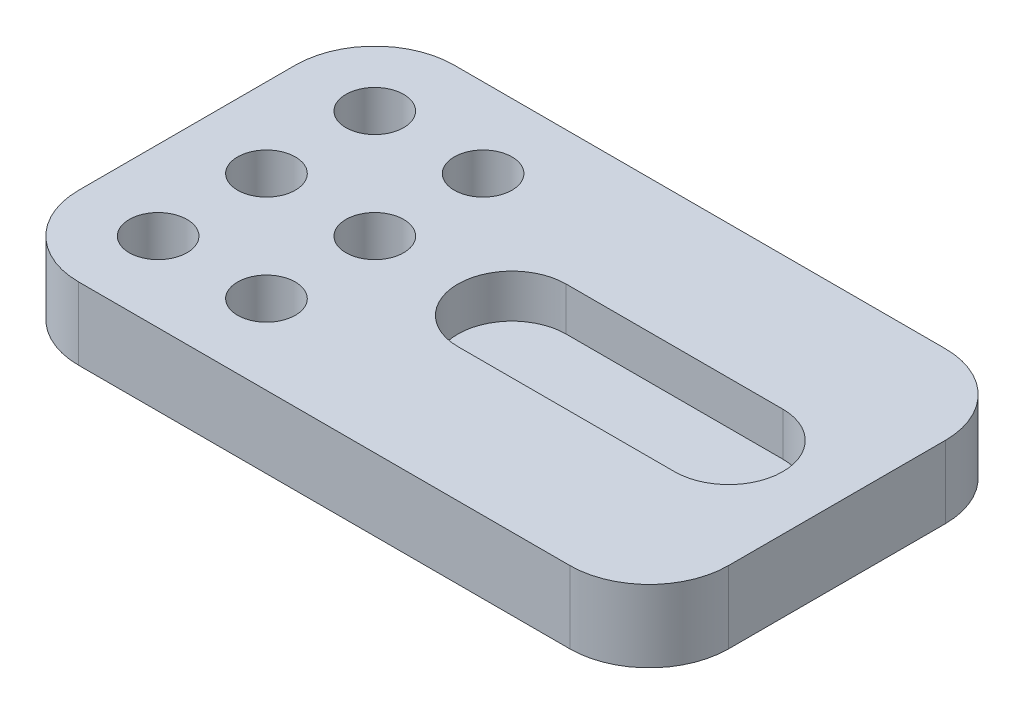
ISO-10303-21;
HEADER;
FILE_DESCRIPTION(('STEP AP214'),'2;1');
FILE_NAME('part.step','',(''),(''),'','','');
FILE_SCHEMA(('AUTOMOTIVE_DESIGN { 1 0 10303 214 1 1 1 1 }'));
ENDSEC;
DATA;
#1=APPLICATION_CONTEXT('core data for automotive mechanical design processes');
#2=APPLICATION_PROTOCOL_DEFINITION('international standard','automotive_design',2000,#1);
#3=PRODUCT_CONTEXT('',#1,'mechanical');
#4=PRODUCT('Part','Part','',(#3));
#5=PRODUCT_RELATED_PRODUCT_CATEGORY('part','',(#4));
#6=PRODUCT_DEFINITION_FORMATION('','',#4);
#7=PRODUCT_DEFINITION_CONTEXT('part definition',#1,'design');
#8=PRODUCT_DEFINITION('design','',#6,#7);
#9=PRODUCT_DEFINITION_SHAPE('','',#8);
#10=(LENGTH_UNIT() NAMED_UNIT(*) SI_UNIT(.MILLI.,.METRE.));
#11=(NAMED_UNIT(*) PLANE_ANGLE_UNIT() SI_UNIT($,.RADIAN.));
#12=(NAMED_UNIT(*) SI_UNIT($,.STERADIAN.) SOLID_ANGLE_UNIT());
#13=UNCERTAINTY_MEASURE_WITH_UNIT(LENGTH_MEASURE(1.E-05),#10,'distance_accuracy_value','');
#14=(GEOMETRIC_REPRESENTATION_CONTEXT(3) GLOBAL_UNCERTAINTY_ASSIGNED_CONTEXT((#13)) GLOBAL_UNIT_ASSIGNED_CONTEXT((#10,
#11,#12)) REPRESENTATION_CONTEXT('',''));
#15=CARTESIAN_POINT('',(0.,0.,0.));
#16=DIRECTION('',(0.,0.,1.));
#17=DIRECTION('',(1.,0.,0.));
#18=AXIS2_PLACEMENT_3D('',#15,#16,#17);
#19=CARTESIAN_POINT('',(90.,20.,-52.));
#20=DIRECTION('',(-1.,0.,0.));
#21=DIRECTION('',(0.,0.,1.));
#22=AXIS2_PLACEMENT_3D('',#19,#20,#21);
#23=PLANE('',#22);
#24=DIRECTION('',(0.,0.,-1.));
#25=VECTOR('',#24,1.);
#26=CARTESIAN_POINT('',(90.,0.,-52.));
#27=LINE('',#26,#25);
#28=CARTESIAN_POINT('',(90.,0.,30.));
#29=VERTEX_POINT('',#28);
#30=CARTESIAN_POINT('',(90.,0.,-30.));
#31=VERTEX_POINT('',#30);
#32=EDGE_CURVE('E230',#29,#31,#27,.T.);
#33=ORIENTED_EDGE('',*,*,#32,.T.);
#34=DIRECTION('',(0.,-1.,0.));
#35=VECTOR('',#34,1.);
#36=CARTESIAN_POINT('',(90.,20.,-30.));
#37=LINE('',#36,#35);
#38=CARTESIAN_POINT('',(90.,20.,-30.));
#39=VERTEX_POINT('',#38);
#40=EDGE_CURVE('E286',#31,#39,#37,.F.);
#41=ORIENTED_EDGE('',*,*,#40,.T.);
#42=DIRECTION('',(0.,0.,-1.));
#43=VECTOR('',#42,1.);
#44=CARTESIAN_POINT('',(90.,20.,-52.));
#45=LINE('',#44,#43);
#46=CARTESIAN_POINT('',(90.,20.,30.));
#47=VERTEX_POINT('',#46);
#48=EDGE_CURVE('E234',#47,#39,#45,.T.);
#49=ORIENTED_EDGE('',*,*,#48,.F.);
#50=DIRECTION('',(0.,-1.,0.));
#51=VECTOR('',#50,1.);
#52=CARTESIAN_POINT('',(90.,20.,30.));
#53=LINE('',#52,#51);
#54=EDGE_CURVE('E282',#47,#29,#53,.T.);
#55=ORIENTED_EDGE('',*,*,#54,.T.);
#56=EDGE_LOOP('',(#33,#41,#49,#55));
#57=FACE_BOUND('',#56,.T.);
#58=ADVANCED_FACE('F45',(#57),#23,.F.);
#59=CARTESIAN_POINT('',(-90.,20.,-52.));
#60=DIRECTION('',(0.,0.,1.));
#61=DIRECTION('',(1.,0.,0.));
#62=AXIS2_PLACEMENT_3D('',#59,#60,#61);
#63=PLANE('',#62);
#64=DIRECTION('',(-1.,0.,0.));
#65=VECTOR('',#64,1.);
#66=CARTESIAN_POINT('',(-90.,20.,-52.));
#67=LINE('',#66,#65);
#68=CARTESIAN_POINT('',(67.9999999999999,20.,-52.));
#69=VERTEX_POINT('',#68);
#70=CARTESIAN_POINT('',(-68.,20.,-52.));
#71=VERTEX_POINT('',#70);
#72=EDGE_CURVE('E238',#69,#71,#67,.T.);
#73=ORIENTED_EDGE('',*,*,#72,.F.);
#74=DIRECTION('',(0.,-1.,0.));
#75=VECTOR('',#74,1.);
#76=CARTESIAN_POINT('',(68.,20.,-52.));
#77=LINE('',#76,#75);
#78=CARTESIAN_POINT('',(67.9999999999999,0.,-52.));
#79=VERTEX_POINT('',#78);
#80=EDGE_CURVE('E266',#69,#79,#77,.T.);
#81=ORIENTED_EDGE('',*,*,#80,.T.);
#82=DIRECTION('',(-1.,0.,0.));
#83=VECTOR('',#82,1.);
#84=CARTESIAN_POINT('',(-90.,0.,-52.));
#85=LINE('',#84,#83);
#86=CARTESIAN_POINT('',(-68.,0.,-52.));
#87=VERTEX_POINT('',#86);
#88=EDGE_CURVE('E254',#79,#87,#85,.T.);
#89=ORIENTED_EDGE('',*,*,#88,.T.);
#90=DIRECTION('',(0.,-1.,0.));
#91=VECTOR('',#90,1.);
#92=CARTESIAN_POINT('',(-68.,20.,-52.));
#93=LINE('',#92,#91);
#94=EDGE_CURVE('E250',#87,#71,#93,.F.);
#95=ORIENTED_EDGE('',*,*,#94,.T.);
#96=EDGE_LOOP('',(#73,#81,#89,#95));
#97=FACE_BOUND('',#96,.T.);
#98=ADVANCED_FACE('F341',(#97),#63,.F.);
#99=CARTESIAN_POINT('',(-90.,20.,-52.));
#100=DIRECTION('',(1.,0.,0.));
#101=DIRECTION('',(0.,0.,-1.));
#102=AXIS2_PLACEMENT_3D('',#99,#100,#101);
#103=PLANE('',#102);
#104=DIRECTION('',(0.,0.,1.));
#105=VECTOR('',#104,1.);
#106=CARTESIAN_POINT('',(-90.,0.,-52.));
#107=LINE('',#106,#105);
#108=CARTESIAN_POINT('',(-90.,0.,-30.));
#109=VERTEX_POINT('',#108);
#110=CARTESIAN_POINT('',(-90.,0.,30.));
#111=VERTEX_POINT('',#110);
#112=EDGE_CURVE('E258',#109,#111,#107,.T.);
#113=ORIENTED_EDGE('',*,*,#112,.T.);
#114=DIRECTION('',(0.,-1.,0.));
#115=VECTOR('',#114,1.);
#116=CARTESIAN_POINT('',(-90.,20.,30.));
#117=LINE('',#116,#115);
#118=CARTESIAN_POINT('',(-90.,20.,30.));
#119=VERTEX_POINT('',#118);
#120=EDGE_CURVE('E11',#111,#119,#117,.F.);
#121=ORIENTED_EDGE('',*,*,#120,.T.);
#122=DIRECTION('',(0.,0.,1.));
#123=VECTOR('',#122,1.);
#124=CARTESIAN_POINT('',(-90.,20.,-52.));
#125=LINE('',#124,#123);
#126=CARTESIAN_POINT('',(-90.,20.,-30.));
#127=VERTEX_POINT('',#126);
#128=EDGE_CURVE('E243',#127,#119,#125,.T.);
#129=ORIENTED_EDGE('',*,*,#128,.F.);
#130=DIRECTION('',(0.,-1.,0.));
#131=VECTOR('',#130,1.);
#132=CARTESIAN_POINT('',(-90.,20.,-30.));
#133=LINE('',#132,#131);
#134=EDGE_CURVE('E54',#127,#109,#133,.T.);
#135=ORIENTED_EDGE('',*,*,#134,.T.);
#136=EDGE_LOOP('',(#113,#121,#129,#135));
#137=FACE_BOUND('',#136,.T.);
#138=ADVANCED_FACE('F312',(#137),#103,.F.);
#139=CARTESIAN_POINT('',(-90.,20.,52.));
#140=DIRECTION('',(0.,0.,-1.));
#141=DIRECTION('',(-1.,0.,0.));
#142=AXIS2_PLACEMENT_3D('',#139,#140,#141);
#143=PLANE('',#142);
#144=DIRECTION('',(1.,0.,0.));
#145=VECTOR('',#144,1.);
#146=CARTESIAN_POINT('',(-90.,0.,52.));
#147=LINE('',#146,#145);
#148=CARTESIAN_POINT('',(-68.,0.,52.));
#149=VERTEX_POINT('',#148);
#150=CARTESIAN_POINT('',(67.9999999999999,0.,52.));
#151=VERTEX_POINT('',#150);
#152=EDGE_CURVE('E239',#149,#151,#147,.T.);
#153=ORIENTED_EDGE('',*,*,#152,.T.);
#154=DIRECTION('',(0.,-1.,0.));
#155=VECTOR('',#154,1.);
#156=CARTESIAN_POINT('',(68.,20.,52.));
#157=LINE('',#156,#155);
#158=CARTESIAN_POINT('',(67.9999999999999,20.,52.));
#159=VERTEX_POINT('',#158);
#160=EDGE_CURVE('E69',#151,#159,#157,.F.);
#161=ORIENTED_EDGE('',*,*,#160,.T.);
#162=DIRECTION('',(1.,0.,0.));
#163=VECTOR('',#162,1.);
#164=CARTESIAN_POINT('',(-90.,20.,52.));
#165=LINE('',#164,#163);
#166=CARTESIAN_POINT('',(-68.,20.,52.));
#167=VERTEX_POINT('',#166);
#168=EDGE_CURVE('E247',#167,#159,#165,.T.);
#169=ORIENTED_EDGE('',*,*,#168,.F.);
#170=DIRECTION('',(0.,-1.,0.));
#171=VECTOR('',#170,1.);
#172=CARTESIAN_POINT('',(-68.,20.,52.));
#173=LINE('',#172,#171);
#174=EDGE_CURVE('E301',#167,#149,#173,.T.);
#175=ORIENTED_EDGE('',*,*,#174,.T.);
#176=EDGE_LOOP('',(#153,#161,#169,#175));
#177=FACE_BOUND('',#176,.T.);
#178=ADVANCED_FACE('F324',(#177),#143,.F.);
#179=CARTESIAN_POINT('',(0.,20.,0.));
#180=DIRECTION('',(0.,1.,0.));
#181=DIRECTION('',(0.,0.,1.));
#182=AXIS2_PLACEMENT_3D('',#179,#180,#181);
#183=PLANE('',#182);
#184=CARTESIAN_POINT('',(0.,20.,0.));
#185=DIRECTION('',(0.,1.,0.));
#186=DIRECTION('',(0.,0.,1.));
#187=AXIS2_PLACEMENT_3D('',#184,#185,#186);
#188=CIRCLE('',#187,15.);
#189=CARTESIAN_POINT('',(0.,20.,-15.));
#190=VERTEX_POINT('',#189);
#191=CARTESIAN_POINT('',(0.,20.,15.));
#192=VERTEX_POINT('',#191);
#193=EDGE_CURVE('E61',#190,#192,#188,.T.);
#194=ORIENTED_EDGE('',*,*,#193,.F.);
#195=DIRECTION('',(1.,0.,0.));
#196=VECTOR('',#195,1.);
#197=CARTESIAN_POINT('',(0.,20.,-15.));
#198=LINE('',#197,#196);
#199=CARTESIAN_POINT('',(60.,20.,-15.));
#200=VERTEX_POINT('',#199);
#201=EDGE_CURVE('E158',#190,#200,#198,.T.);
#202=ORIENTED_EDGE('',*,*,#201,.T.);
#203=CARTESIAN_POINT('',(60.,20.,0.));
#204=DIRECTION('',(0.,1.,0.));
#205=DIRECTION('',(0.,0.,1.));
#206=AXIS2_PLACEMENT_3D('',#203,#204,#205);
#207=CIRCLE('',#206,15.);
#208=CARTESIAN_POINT('',(60.,20.,15.));
#209=VERTEX_POINT('',#208);
#210=EDGE_CURVE('E162',#209,#200,#207,.T.);
#211=ORIENTED_EDGE('',*,*,#210,.F.);
#212=DIRECTION('',(1.,0.,0.));
#213=VECTOR('',#212,1.);
#214=CARTESIAN_POINT('',(0.,20.,15.));
#215=LINE('',#214,#213);
#216=EDGE_CURVE('E171',#192,#209,#215,.T.);
#217=ORIENTED_EDGE('',*,*,#216,.F.);
#218=EDGE_LOOP('',(#194,#202,#211,#217));
#219=FACE_BOUND('',#218,.T.);
#220=CARTESIAN_POINT('',(-38.,20.,-30.));
#221=DIRECTION('',(0.,1.,0.));
#222=DIRECTION('',(0.,0.,1.));
#223=AXIS2_PLACEMENT_3D('',#220,#221,#222);
#224=CIRCLE('',#223,8.);
#225=CARTESIAN_POINT('',(-38.,20.,-22.));
#226=VERTEX_POINT('',#225);
#227=EDGE_CURVE('E219',#226,#226,#224,.T.);
#228=ORIENTED_EDGE('',*,*,#227,.F.);
#229=EDGE_LOOP('',(#228));
#230=FACE_BOUND('',#229,.T.);
#231=CARTESIAN_POINT('',(-38.,20.,0.));
#232=DIRECTION('',(0.,1.,0.));
#233=DIRECTION('',(0.,0.,1.));
#234=AXIS2_PLACEMENT_3D('',#231,#232,#233);
#235=CIRCLE('',#234,8.);
#236=CARTESIAN_POINT('',(-38.,20.,7.99999999999999));
#237=VERTEX_POINT('',#236);
#238=EDGE_CURVE('E211',#237,#237,#235,.T.);
#239=ORIENTED_EDGE('',*,*,#238,.F.);
#240=EDGE_LOOP('',(#239));
#241=FACE_BOUND('',#240,.T.);
#242=CARTESIAN_POINT('',(-38.,20.,30.));
#243=DIRECTION('',(0.,1.,0.));
#244=DIRECTION('',(0.,0.,1.));
#245=AXIS2_PLACEMENT_3D('',#242,#243,#244);
#246=CIRCLE('',#245,8.);
#247=CARTESIAN_POINT('',(-38.,20.,38.));
#248=VERTEX_POINT('',#247);
#249=EDGE_CURVE('E203',#248,#248,#246,.T.);
#250=ORIENTED_EDGE('',*,*,#249,.F.);
#251=EDGE_LOOP('',(#250));
#252=FACE_BOUND('',#251,.T.);
#253=CARTESIAN_POINT('',(-68.,20.,30.));
#254=DIRECTION('',(0.,1.,0.));
#255=DIRECTION('',(0.,0.,1.));
#256=AXIS2_PLACEMENT_3D('',#253,#254,#255);
#257=CIRCLE('',#256,8.);
#258=CARTESIAN_POINT('',(-68.,20.,38.));
#259=VERTEX_POINT('',#258);
#260=EDGE_CURVE('E195',#259,#259,#257,.T.);
#261=ORIENTED_EDGE('',*,*,#260,.F.);
#262=EDGE_LOOP('',(#261));
#263=FACE_BOUND('',#262,.T.);
#264=CARTESIAN_POINT('',(-68.,20.,0.));
#265=DIRECTION('',(0.,1.,0.));
#266=DIRECTION('',(0.,0.,1.));
#267=AXIS2_PLACEMENT_3D('',#264,#265,#266);
#268=CIRCLE('',#267,8.);
#269=CARTESIAN_POINT('',(-68.,20.,7.99999999999999));
#270=VERTEX_POINT('',#269);
#271=EDGE_CURVE('E186',#270,#270,#268,.T.);
#272=ORIENTED_EDGE('',*,*,#271,.F.);
#273=EDGE_LOOP('',(#272));
#274=FACE_BOUND('',#273,.T.);
#275=CARTESIAN_POINT('',(-68.,20.,-30.));
#276=DIRECTION('',(0.,1.,0.));
#277=DIRECTION('',(0.,0.,1.));
#278=AXIS2_PLACEMENT_3D('',#275,#276,#277);
#279=CIRCLE('',#278,8.);
#280=CARTESIAN_POINT('',(-68.,20.,-22.));
#281=VERTEX_POINT('',#280);
#282=EDGE_CURVE('E190',#281,#281,#279,.T.);
#283=ORIENTED_EDGE('',*,*,#282,.F.);
#284=EDGE_LOOP('',(#283));
#285=FACE_BOUND('',#284,.T.);
#286=ORIENTED_EDGE('',*,*,#48,.T.);
#287=CARTESIAN_POINT('',(68.,20.,-30.));
#288=DIRECTION('',(0.,1.,0.));
#289=DIRECTION('',(0.,0.,1.));
#290=AXIS2_PLACEMENT_3D('',#287,#288,#289);
#291=CIRCLE('',#290,22.);
#292=EDGE_CURVE('E298',#39,#69,#291,.T.);
#293=ORIENTED_EDGE('',*,*,#292,.T.);
#294=ORIENTED_EDGE('',*,*,#72,.T.);
#295=CARTESIAN_POINT('',(-68.,20.,-30.));
#296=DIRECTION('',(0.,1.,0.));
#297=DIRECTION('',(0.,0.,1.));
#298=AXIS2_PLACEMENT_3D('',#295,#296,#297);
#299=CIRCLE('',#298,22.);
#300=EDGE_CURVE('E289',#71,#127,#299,.T.);
#301=ORIENTED_EDGE('',*,*,#300,.T.);
#302=ORIENTED_EDGE('',*,*,#128,.T.);
#303=CARTESIAN_POINT('',(-68.,20.,30.));
#304=DIRECTION('',(0.,1.,0.));
#305=DIRECTION('',(0.,0.,1.));
#306=AXIS2_PLACEMENT_3D('',#303,#304,#305);
#307=CIRCLE('',#306,22.);
#308=EDGE_CURVE('E292',#119,#167,#307,.T.);
#309=ORIENTED_EDGE('',*,*,#308,.T.);
#310=ORIENTED_EDGE('',*,*,#168,.T.);
#311=CARTESIAN_POINT('',(68.,20.,30.));
#312=DIRECTION('',(0.,1.,0.));
#313=DIRECTION('',(0.,0.,1.));
#314=AXIS2_PLACEMENT_3D('',#311,#312,#313);
#315=CIRCLE('',#314,22.);
#316=EDGE_CURVE('E295',#159,#47,#315,.T.);
#317=ORIENTED_EDGE('',*,*,#316,.T.);
#318=EDGE_LOOP('',(#286,#293,#294,#301,#302,#309,#310,#317));
#319=FACE_BOUND('',#318,.T.);
#320=ADVANCED_FACE('F327',(#219,#230,#241,#252,#263,#274,#285,#319),#183,.T.);
#321=CARTESIAN_POINT('',(0.,0.,0.));
#322=DIRECTION('',(0.,1.,0.));
#323=DIRECTION('',(0.,0.,1.));
#324=AXIS2_PLACEMENT_3D('',#321,#322,#323);
#325=PLANE('',#324);
#326=CARTESIAN_POINT('',(-38.,0.,-30.));
#327=DIRECTION('',(0.,1.,0.));
#328=DIRECTION('',(0.,0.,1.));
#329=AXIS2_PLACEMENT_3D('',#326,#327,#328);
#330=CIRCLE('',#329,8.);
#331=CARTESIAN_POINT('',(-38.,0.,-22.));
#332=VERTEX_POINT('',#331);
#333=EDGE_CURVE('E180',#332,#332,#330,.T.);
#334=ORIENTED_EDGE('',*,*,#333,.T.);
#335=EDGE_LOOP('',(#334));
#336=FACE_BOUND('',#335,.T.);
#337=CARTESIAN_POINT('',(-38.,0.,0.));
#338=DIRECTION('',(0.,1.,0.));
#339=DIRECTION('',(0.,0.,1.));
#340=AXIS2_PLACEMENT_3D('',#337,#338,#339);
#341=CIRCLE('',#340,8.);
#342=CARTESIAN_POINT('',(-38.,0.,7.99999999999999));
#343=VERTEX_POINT('',#342);
#344=EDGE_CURVE('E215',#343,#343,#341,.T.);
#345=ORIENTED_EDGE('',*,*,#344,.T.);
#346=EDGE_LOOP('',(#345));
#347=FACE_BOUND('',#346,.T.);
#348=CARTESIAN_POINT('',(-38.,0.,30.));
#349=DIRECTION('',(0.,1.,0.));
#350=DIRECTION('',(0.,0.,1.));
#351=AXIS2_PLACEMENT_3D('',#348,#349,#350);
#352=CIRCLE('',#351,8.);
#353=CARTESIAN_POINT('',(-38.,0.,38.));
#354=VERTEX_POINT('',#353);
#355=EDGE_CURVE('E207',#354,#354,#352,.T.);
#356=ORIENTED_EDGE('',*,*,#355,.T.);
#357=EDGE_LOOP('',(#356));
#358=FACE_BOUND('',#357,.T.);
#359=CARTESIAN_POINT('',(-68.,0.,30.));
#360=DIRECTION('',(0.,1.,0.));
#361=DIRECTION('',(0.,0.,1.));
#362=AXIS2_PLACEMENT_3D('',#359,#360,#361);
#363=CIRCLE('',#362,8.);
#364=CARTESIAN_POINT('',(-68.,0.,38.));
#365=VERTEX_POINT('',#364);
#366=EDGE_CURVE('E199',#365,#365,#363,.T.);
#367=ORIENTED_EDGE('',*,*,#366,.T.);
#368=EDGE_LOOP('',(#367));
#369=FACE_BOUND('',#368,.T.);
#370=CARTESIAN_POINT('',(-68.,0.,0.));
#371=DIRECTION('',(0.,1.,0.));
#372=DIRECTION('',(0.,0.,1.));
#373=AXIS2_PLACEMENT_3D('',#370,#371,#372);
#374=CIRCLE('',#373,8.);
#375=CARTESIAN_POINT('',(-68.,0.,7.99999999999999));
#376=VERTEX_POINT('',#375);
#377=EDGE_CURVE('E191',#376,#376,#374,.T.);
#378=ORIENTED_EDGE('',*,*,#377,.T.);
#379=EDGE_LOOP('',(#378));
#380=FACE_BOUND('',#379,.T.);
#381=CARTESIAN_POINT('',(-68.,0.,-30.));
#382=DIRECTION('',(0.,1.,0.));
#383=DIRECTION('',(0.,0.,1.));
#384=AXIS2_PLACEMENT_3D('',#381,#382,#383);
#385=CIRCLE('',#384,8.);
#386=CARTESIAN_POINT('',(-68.,0.,-22.));
#387=VERTEX_POINT('',#386);
#388=EDGE_CURVE('E226',#387,#387,#385,.T.);
#389=ORIENTED_EDGE('',*,*,#388,.T.);
#390=EDGE_LOOP('',(#389));
#391=FACE_BOUND('',#390,.T.);
#392=ORIENTED_EDGE('',*,*,#88,.F.);
#393=CARTESIAN_POINT('',(68.,0.,-30.));
#394=DIRECTION('',(0.,1.,0.));
#395=DIRECTION('',(0.,0.,1.));
#396=AXIS2_PLACEMENT_3D('',#393,#394,#395);
#397=CIRCLE('',#396,22.);
#398=EDGE_CURVE('E279',#79,#31,#397,.F.);
#399=ORIENTED_EDGE('',*,*,#398,.T.);
#400=ORIENTED_EDGE('',*,*,#32,.F.);
#401=CARTESIAN_POINT('',(68.,0.,30.));
#402=DIRECTION('',(0.,1.,0.));
#403=DIRECTION('',(0.,0.,1.));
#404=AXIS2_PLACEMENT_3D('',#401,#402,#403);
#405=CIRCLE('',#404,22.);
#406=EDGE_CURVE('E276',#29,#151,#405,.F.);
#407=ORIENTED_EDGE('',*,*,#406,.T.);
#408=ORIENTED_EDGE('',*,*,#152,.F.);
#409=CARTESIAN_POINT('',(-68.,0.,30.));
#410=DIRECTION('',(0.,1.,0.));
#411=DIRECTION('',(0.,0.,1.));
#412=AXIS2_PLACEMENT_3D('',#409,#410,#411);
#413=CIRCLE('',#412,22.);
#414=EDGE_CURVE('E273',#149,#111,#413,.F.);
#415=ORIENTED_EDGE('',*,*,#414,.T.);
#416=ORIENTED_EDGE('',*,*,#112,.F.);
#417=CARTESIAN_POINT('',(-68.,0.,-30.));
#418=DIRECTION('',(0.,1.,0.));
#419=DIRECTION('',(0.,0.,1.));
#420=AXIS2_PLACEMENT_3D('',#417,#418,#419);
#421=CIRCLE('',#420,22.);
#422=EDGE_CURVE('E270',#109,#87,#421,.F.);
#423=ORIENTED_EDGE('',*,*,#422,.T.);
#424=EDGE_LOOP('',(#392,#399,#400,#407,#408,#415,#416,#423));
#425=FACE_BOUND('',#424,.T.);
#426=ADVANCED_FACE('F318',(#336,#347,#358,#369,#380,#391,#425),#325,.F.);
#427=CARTESIAN_POINT('',(68.,20.,-30.));
#428=DIRECTION('',(0.,-1.,0.));
#429=DIRECTION('',(0.,0.,-1.));
#430=AXIS2_PLACEMENT_3D('',#427,#428,#429);
#431=CYLINDRICAL_SURFACE('',#430,22.);
#432=ORIENTED_EDGE('',*,*,#292,.F.);
#433=ORIENTED_EDGE('',*,*,#40,.F.);
#434=ORIENTED_EDGE('',*,*,#398,.F.);
#435=ORIENTED_EDGE('',*,*,#80,.F.);
#436=EDGE_LOOP('',(#432,#433,#434,#435));
#437=FACE_BOUND('',#436,.T.);
#438=ADVANCED_FACE('F338',(#437),#431,.T.);
#439=CARTESIAN_POINT('',(68.,20.,30.));
#440=DIRECTION('',(0.,-1.,0.));
#441=DIRECTION('',(0.,0.,-1.));
#442=AXIS2_PLACEMENT_3D('',#439,#440,#441);
#443=CYLINDRICAL_SURFACE('',#442,22.);
#444=ORIENTED_EDGE('',*,*,#316,.F.);
#445=ORIENTED_EDGE('',*,*,#160,.F.);
#446=ORIENTED_EDGE('',*,*,#406,.F.);
#447=ORIENTED_EDGE('',*,*,#54,.F.);
#448=EDGE_LOOP('',(#444,#445,#446,#447));
#449=FACE_BOUND('',#448,.T.);
#450=ADVANCED_FACE('F331',(#449),#443,.T.);
#451=CARTESIAN_POINT('',(-68.,20.,30.));
#452=DIRECTION('',(0.,-1.,0.));
#453=DIRECTION('',(0.,0.,-1.));
#454=AXIS2_PLACEMENT_3D('',#451,#452,#453);
#455=CYLINDRICAL_SURFACE('',#454,22.);
#456=ORIENTED_EDGE('',*,*,#308,.F.);
#457=ORIENTED_EDGE('',*,*,#120,.F.);
#458=ORIENTED_EDGE('',*,*,#414,.F.);
#459=ORIENTED_EDGE('',*,*,#174,.F.);
#460=EDGE_LOOP('',(#456,#457,#458,#459));
#461=FACE_BOUND('',#460,.T.);
#462=ADVANCED_FACE('F323',(#461),#455,.T.);
#463=CARTESIAN_POINT('',(-68.,20.,-30.));
#464=DIRECTION('',(0.,-1.,0.));
#465=DIRECTION('',(0.,0.,-1.));
#466=AXIS2_PLACEMENT_3D('',#463,#464,#465);
#467=CYLINDRICAL_SURFACE('',#466,22.);
#468=ORIENTED_EDGE('',*,*,#300,.F.);
#469=ORIENTED_EDGE('',*,*,#94,.F.);
#470=ORIENTED_EDGE('',*,*,#422,.F.);
#471=ORIENTED_EDGE('',*,*,#134,.F.);
#472=EDGE_LOOP('',(#468,#469,#470,#471));
#473=FACE_BOUND('',#472,.T.);
#474=ADVANCED_FACE('F47',(#473),#467,.T.);
#475=CARTESIAN_POINT('',(-68.,0.,-30.));
#476=DIRECTION('',(0.,1.,0.));
#477=DIRECTION('',(0.,0.,1.));
#478=AXIS2_PLACEMENT_3D('',#475,#476,#477);
#479=CYLINDRICAL_SURFACE('',#478,8.);
#480=ORIENTED_EDGE('',*,*,#388,.F.);
#481=EDGE_LOOP('',(#480));
#482=FACE_BOUND('',#481,.T.);
#483=ORIENTED_EDGE('',*,*,#282,.T.);
#484=EDGE_LOOP('',(#483));
#485=FACE_BOUND('',#484,.T.);
#486=ADVANCED_FACE('F344',(#482,#485),#479,.F.);
#487=CARTESIAN_POINT('',(-68.,0.,0.));
#488=DIRECTION('',(0.,1.,0.));
#489=DIRECTION('',(0.,0.,1.));
#490=AXIS2_PLACEMENT_3D('',#487,#488,#489);
#491=CYLINDRICAL_SURFACE('',#490,8.);
#492=ORIENTED_EDGE('',*,*,#377,.F.);
#493=EDGE_LOOP('',(#492));
#494=FACE_BOUND('',#493,.T.);
#495=ORIENTED_EDGE('',*,*,#271,.T.);
#496=EDGE_LOOP('',(#495));
#497=FACE_BOUND('',#496,.T.);
#498=ADVANCED_FACE('F349',(#494,#497),#491,.F.);
#499=CARTESIAN_POINT('',(-68.,0.,30.));
#500=DIRECTION('',(0.,1.,0.));
#501=DIRECTION('',(0.,0.,1.));
#502=AXIS2_PLACEMENT_3D('',#499,#500,#501);
#503=CYLINDRICAL_SURFACE('',#502,8.);
#504=ORIENTED_EDGE('',*,*,#366,.F.);
#505=EDGE_LOOP('',(#504));
#506=FACE_BOUND('',#505,.T.);
#507=ORIENTED_EDGE('',*,*,#260,.T.);
#508=EDGE_LOOP('',(#507));
#509=FACE_BOUND('',#508,.T.);
#510=ADVANCED_FACE('F409',(#506,#509),#503,.F.);
#511=CARTESIAN_POINT('',(-38.,0.,30.));
#512=DIRECTION('',(0.,1.,0.));
#513=DIRECTION('',(0.,0.,1.));
#514=AXIS2_PLACEMENT_3D('',#511,#512,#513);
#515=CYLINDRICAL_SURFACE('',#514,8.);
#516=ORIENTED_EDGE('',*,*,#355,.F.);
#517=EDGE_LOOP('',(#516));
#518=FACE_BOUND('',#517,.T.);
#519=ORIENTED_EDGE('',*,*,#249,.T.);
#520=EDGE_LOOP('',(#519));
#521=FACE_BOUND('',#520,.T.);
#522=ADVANCED_FACE('F422',(#518,#521),#515,.F.);
#523=CARTESIAN_POINT('',(-38.,0.,0.));
#524=DIRECTION('',(0.,1.,0.));
#525=DIRECTION('',(0.,0.,1.));
#526=AXIS2_PLACEMENT_3D('',#523,#524,#525);
#527=CYLINDRICAL_SURFACE('',#526,8.);
#528=ORIENTED_EDGE('',*,*,#344,.F.);
#529=EDGE_LOOP('',(#528));
#530=FACE_BOUND('',#529,.T.);
#531=ORIENTED_EDGE('',*,*,#238,.T.);
#532=EDGE_LOOP('',(#531));
#533=FACE_BOUND('',#532,.T.);
#534=ADVANCED_FACE('F434',(#530,#533),#527,.F.);
#535=CARTESIAN_POINT('',(-38.,0.,-30.));
#536=DIRECTION('',(0.,1.,0.));
#537=DIRECTION('',(0.,0.,1.));
#538=AXIS2_PLACEMENT_3D('',#535,#536,#537);
#539=CYLINDRICAL_SURFACE('',#538,8.);
#540=ORIENTED_EDGE('',*,*,#333,.F.);
#541=EDGE_LOOP('',(#540));
#542=FACE_BOUND('',#541,.T.);
#543=ORIENTED_EDGE('',*,*,#227,.T.);
#544=EDGE_LOOP('',(#543));
#545=FACE_BOUND('',#544,.T.);
#546=ADVANCED_FACE('F445',(#542,#545),#539,.F.);
#547=CARTESIAN_POINT('',(0.,8.,0.));
#548=DIRECTION('',(0.,1.,0.));
#549=DIRECTION('',(0.,0.,1.));
#550=AXIS2_PLACEMENT_3D('',#547,#548,#549);
#551=CYLINDRICAL_SURFACE('',#550,15.);
#552=ORIENTED_EDGE('',*,*,#193,.T.);
#553=DIRECTION('',(0.,1.,0.));
#554=VECTOR('',#553,1.);
#555=CARTESIAN_POINT('',(0.,8.,15.));
#556=LINE('',#555,#554);
#557=CARTESIAN_POINT('',(0.,8.,15.));
#558=VERTEX_POINT('',#557);
#559=EDGE_CURVE('E134',#558,#192,#556,.T.);
#560=ORIENTED_EDGE('',*,*,#559,.F.);
#561=CARTESIAN_POINT('',(0.,8.,0.));
#562=DIRECTION('',(0.,1.,0.));
#563=DIRECTION('',(0.,0.,1.));
#564=AXIS2_PLACEMENT_3D('',#561,#562,#563);
#565=CIRCLE('',#564,15.);
#566=CARTESIAN_POINT('',(0.,8.,-15.));
#567=VERTEX_POINT('',#566);
#568=EDGE_CURVE('E138',#567,#558,#565,.T.);
#569=ORIENTED_EDGE('',*,*,#568,.F.);
#570=DIRECTION('',(0.,1.,0.));
#571=VECTOR('',#570,1.);
#572=CARTESIAN_POINT('',(0.,8.,-15.));
#573=LINE('',#572,#571);
#574=EDGE_CURVE('E177',#567,#190,#573,.T.);
#575=ORIENTED_EDGE('',*,*,#574,.T.);
#576=EDGE_LOOP('',(#552,#560,#569,#575));
#577=FACE_BOUND('',#576,.T.);
#578=ADVANCED_FACE('F136',(#577),#551,.F.);
#579=CARTESIAN_POINT('',(0.,8.,-15.));
#580=DIRECTION('',(0.,0.,1.));
#581=DIRECTION('',(1.,0.,0.));
#582=AXIS2_PLACEMENT_3D('',#579,#580,#581);
#583=PLANE('',#582);
#584=ORIENTED_EDGE('',*,*,#201,.F.);
#585=ORIENTED_EDGE('',*,*,#574,.F.);
#586=DIRECTION('',(1.,0.,0.));
#587=VECTOR('',#586,1.);
#588=CARTESIAN_POINT('',(0.,8.,-15.));
#589=LINE('',#588,#587);
#590=CARTESIAN_POINT('',(60.,8.,-15.));
#591=VERTEX_POINT('',#590);
#592=EDGE_CURVE('E144',#567,#591,#589,.T.);
#593=ORIENTED_EDGE('',*,*,#592,.T.);
#594=DIRECTION('',(0.,1.,0.));
#595=VECTOR('',#594,1.);
#596=CARTESIAN_POINT('',(60.,8.,-15.));
#597=LINE('',#596,#595);
#598=EDGE_CURVE('E181',#591,#200,#597,.T.);
#599=ORIENTED_EDGE('',*,*,#598,.T.);
#600=EDGE_LOOP('',(#584,#585,#593,#599));
#601=FACE_BOUND('',#600,.T.);
#602=ADVANCED_FACE('F478',(#601),#583,.T.);
#603=CARTESIAN_POINT('',(60.,8.,0.));
#604=DIRECTION('',(0.,1.,0.));
#605=DIRECTION('',(0.,0.,1.));
#606=AXIS2_PLACEMENT_3D('',#603,#604,#605);
#607=CYLINDRICAL_SURFACE('',#606,15.);
#608=ORIENTED_EDGE('',*,*,#210,.T.);
#609=ORIENTED_EDGE('',*,*,#598,.F.);
#610=CARTESIAN_POINT('',(60.,8.,0.));
#611=DIRECTION('',(0.,1.,0.));
#612=DIRECTION('',(0.,0.,1.));
#613=AXIS2_PLACEMENT_3D('',#610,#611,#612);
#614=CIRCLE('',#613,15.);
#615=CARTESIAN_POINT('',(60.,8.,15.));
#616=VERTEX_POINT('',#615);
#617=EDGE_CURVE('E153',#616,#591,#614,.T.);
#618=ORIENTED_EDGE('',*,*,#617,.F.);
#619=DIRECTION('',(0.,1.,0.));
#620=VECTOR('',#619,1.);
#621=CARTESIAN_POINT('',(60.,8.,15.));
#622=LINE('',#621,#620);
#623=EDGE_CURVE('E143',#616,#209,#622,.T.);
#624=ORIENTED_EDGE('',*,*,#623,.T.);
#625=EDGE_LOOP('',(#608,#609,#618,#624));
#626=FACE_BOUND('',#625,.T.);
#627=ADVANCED_FACE('F490',(#626),#607,.F.);
#628=CARTESIAN_POINT('',(0.,8.,15.));
#629=DIRECTION('',(0.,0.,1.));
#630=DIRECTION('',(1.,0.,0.));
#631=AXIS2_PLACEMENT_3D('',#628,#629,#630);
#632=PLANE('',#631);
#633=ORIENTED_EDGE('',*,*,#216,.T.);
#634=ORIENTED_EDGE('',*,*,#623,.F.);
#635=DIRECTION('',(1.,0.,0.));
#636=VECTOR('',#635,1.);
#637=CARTESIAN_POINT('',(0.,8.,15.));
#638=LINE('',#637,#636);
#639=EDGE_CURVE('E147',#558,#616,#638,.T.);
#640=ORIENTED_EDGE('',*,*,#639,.F.);
#641=ORIENTED_EDGE('',*,*,#559,.T.);
#642=EDGE_LOOP('',(#633,#634,#640,#641));
#643=FACE_BOUND('',#642,.T.);
#644=ADVANCED_FACE('F148',(#643),#632,.F.);
#645=CARTESIAN_POINT('',(0.,8.,0.));
#646=DIRECTION('',(0.,1.,0.));
#647=DIRECTION('',(0.,0.,1.));
#648=AXIS2_PLACEMENT_3D('',#645,#646,#647);
#649=PLANE('',#648);
#650=ORIENTED_EDGE('',*,*,#568,.T.);
#651=ORIENTED_EDGE('',*,*,#639,.T.);
#652=ORIENTED_EDGE('',*,*,#617,.T.);
#653=ORIENTED_EDGE('',*,*,#592,.F.);
#654=EDGE_LOOP('',(#650,#651,#652,#653));
#655=FACE_BOUND('',#654,.T.);
#656=ADVANCED_FACE('F156',(#655),#649,.T.);
#657=CLOSED_SHELL('',(#58,#98,#138,#178,#320,#426,#438,#450,#462,#474,#486,#498,#510,#522,#534,
#546,#578,#602,#627,#644,#656));
#658=MANIFOLD_SOLID_BREP('B2',#657);
#659=ADVANCED_BREP_SHAPE_REPRESENTATION('',(#18,#658),#14);
#660=SHAPE_DEFINITION_REPRESENTATION(#9,#659);
ENDSEC;
END-ISO-10303-21;
